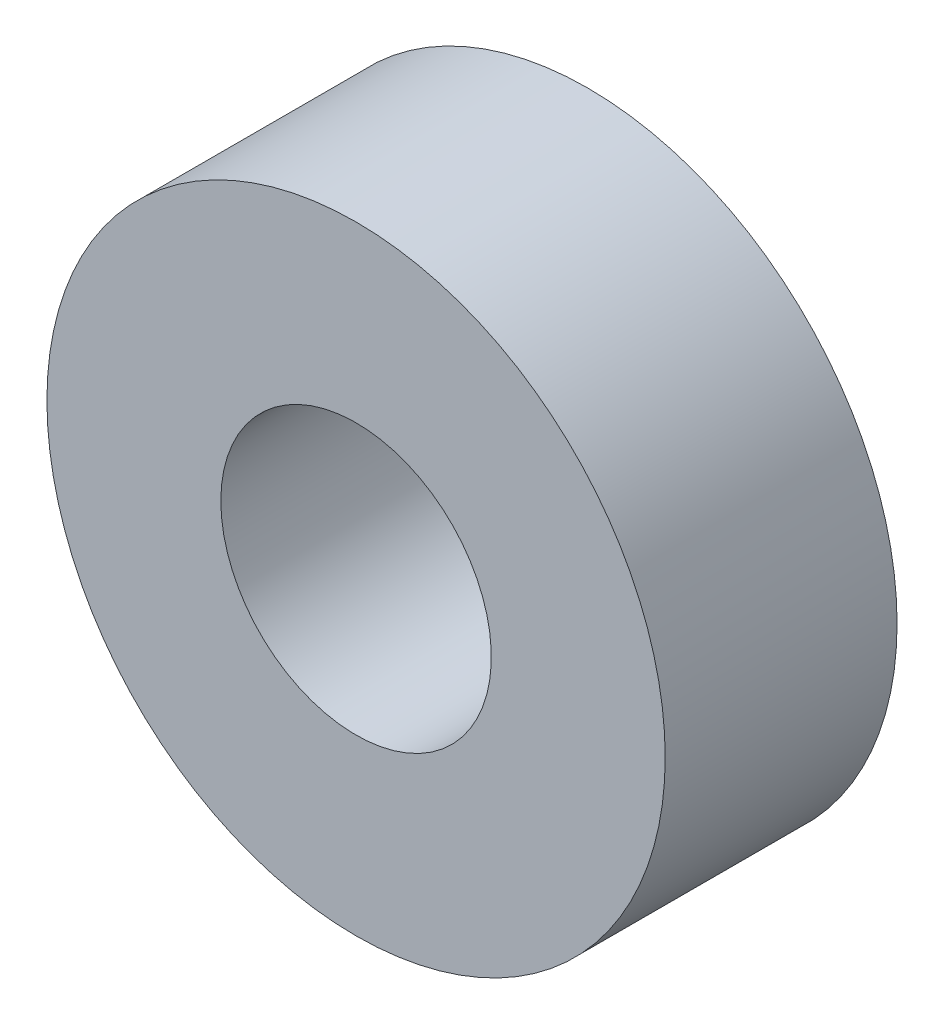
ISO-10303-21;
HEADER;
FILE_DESCRIPTION(('STEP AP214'),'2;1');
FILE_NAME('part.step','',(''),(''),'','','');
FILE_SCHEMA(('AUTOMOTIVE_DESIGN { 1 0 10303 214 1 1 1 1 }'));
ENDSEC;
DATA;
#1=APPLICATION_CONTEXT('core data for automotive mechanical design processes');
#2=APPLICATION_PROTOCOL_DEFINITION('international standard','automotive_design',2000,#1);
#3=PRODUCT_CONTEXT('',#1,'mechanical');
#4=PRODUCT('Part','Part','',(#3));
#5=PRODUCT_RELATED_PRODUCT_CATEGORY('part','',(#4));
#6=PRODUCT_DEFINITION_FORMATION('','',#4);
#7=PRODUCT_DEFINITION_CONTEXT('part definition',#1,'design');
#8=PRODUCT_DEFINITION('design','',#6,#7);
#9=PRODUCT_DEFINITION_SHAPE('','',#8);
#10=(LENGTH_UNIT() NAMED_UNIT(*) SI_UNIT(.MILLI.,.METRE.));
#11=(NAMED_UNIT(*) PLANE_ANGLE_UNIT() SI_UNIT($,.RADIAN.));
#12=(NAMED_UNIT(*) SI_UNIT($,.STERADIAN.) SOLID_ANGLE_UNIT());
#13=UNCERTAINTY_MEASURE_WITH_UNIT(LENGTH_MEASURE(1.E-05),#10,'distance_accuracy_value','');
#14=(GEOMETRIC_REPRESENTATION_CONTEXT(3) GLOBAL_UNCERTAINTY_ASSIGNED_CONTEXT((#13)) GLOBAL_UNIT_ASSIGNED_CONTEXT((#10,
#11,#12)) REPRESENTATION_CONTEXT('',''));
#15=CARTESIAN_POINT('',(0.,0.,0.));
#16=DIRECTION('',(0.,0.,1.));
#17=DIRECTION('',(1.,0.,0.));
#18=AXIS2_PLACEMENT_3D('',#15,#16,#17);
#19=CARTESIAN_POINT('',(0.,0.,0.));
#20=DIRECTION('',(0.,0.,1.));
#21=DIRECTION('',(1.,0.,0.));
#22=AXIS2_PLACEMENT_3D('',#19,#20,#21);
#23=PLANE('',#22);
#24=CARTESIAN_POINT('',(0.,0.,0.));
#25=DIRECTION('',(0.,0.,-1.));
#26=DIRECTION('',(-1.,0.,0.));
#27=AXIS2_PLACEMENT_3D('',#24,#25,#26);
#28=CIRCLE('',#27,1.75);
#29=CARTESIAN_POINT('',(-1.75,0.,0.));
#30=VERTEX_POINT('',#29);
#31=EDGE_CURVE('E27',#30,#30,#28,.F.);
#32=ORIENTED_EDGE('',*,*,#31,.T.);
#33=EDGE_LOOP('',(#32));
#34=FACE_BOUND('',#33,.T.);
#35=CARTESIAN_POINT('',(0.,0.,0.));
#36=DIRECTION('',(0.,0.,-1.));
#37=DIRECTION('',(-1.,0.,0.));
#38=AXIS2_PLACEMENT_3D('',#35,#36,#37);
#39=CIRCLE('',#38,4.);
#40=CARTESIAN_POINT('',(-4.,0.,0.));
#41=VERTEX_POINT('',#40);
#42=EDGE_CURVE('E18',#41,#41,#39,.F.);
#43=ORIENTED_EDGE('',*,*,#42,.F.);
#44=EDGE_LOOP('',(#43));
#45=FACE_BOUND('',#44,.T.);
#46=ADVANCED_FACE('F15',(#34,#45),#23,.F.);
#47=CARTESIAN_POINT('',(0.,0.,3.));
#48=DIRECTION('',(0.,0.,-1.));
#49=DIRECTION('',(-1.,0.,0.));
#50=AXIS2_PLACEMENT_3D('',#47,#48,#49);
#51=CYLINDRICAL_SURFACE('',#50,4.);
#52=ORIENTED_EDGE('',*,*,#42,.T.);
#53=EDGE_LOOP('',(#52));
#54=FACE_BOUND('',#53,.T.);
#55=CARTESIAN_POINT('',(0.,0.,3.));
#56=DIRECTION('',(0.,0.,-1.));
#57=DIRECTION('',(-1.,0.,0.));
#58=AXIS2_PLACEMENT_3D('',#55,#56,#57);
#59=CIRCLE('',#58,4.);
#60=CARTESIAN_POINT('',(-4.,0.,3.));
#61=VERTEX_POINT('',#60);
#62=EDGE_CURVE('E22',#61,#61,#59,.F.);
#63=ORIENTED_EDGE('',*,*,#62,.F.);
#64=EDGE_LOOP('',(#63));
#65=FACE_BOUND('',#64,.T.);
#66=ADVANCED_FACE('F35',(#54,#65),#51,.T.);
#67=CARTESIAN_POINT('',(0.,0.,3.));
#68=DIRECTION('',(0.,0.,-1.));
#69=DIRECTION('',(-1.,0.,0.));
#70=AXIS2_PLACEMENT_3D('',#67,#68,#69);
#71=CYLINDRICAL_SURFACE('',#70,1.75);
#72=CARTESIAN_POINT('',(0.,0.,3.));
#73=DIRECTION('',(0.,0.,-1.));
#74=DIRECTION('',(-1.,0.,0.));
#75=AXIS2_PLACEMENT_3D('',#72,#73,#74);
#76=CIRCLE('',#75,1.75);
#77=CARTESIAN_POINT('',(-1.75,0.,3.));
#78=VERTEX_POINT('',#77);
#79=EDGE_CURVE('E10',#78,#78,#76,.T.);
#80=ORIENTED_EDGE('',*,*,#79,.F.);
#81=EDGE_LOOP('',(#80));
#82=FACE_BOUND('',#81,.T.);
#83=ORIENTED_EDGE('',*,*,#31,.F.);
#84=EDGE_LOOP('',(#83));
#85=FACE_BOUND('',#84,.T.);
#86=ADVANCED_FACE('F43',(#82,#85),#71,.F.);
#87=CARTESIAN_POINT('',(0.,0.,3.));
#88=DIRECTION('',(0.,0.,1.));
#89=DIRECTION('',(1.,0.,0.));
#90=AXIS2_PLACEMENT_3D('',#87,#88,#89);
#91=PLANE('',#90);
#92=ORIENTED_EDGE('',*,*,#79,.T.);
#93=EDGE_LOOP('',(#92));
#94=FACE_BOUND('',#93,.T.);
#95=ORIENTED_EDGE('',*,*,#62,.T.);
#96=EDGE_LOOP('',(#95));
#97=FACE_BOUND('',#96,.T.);
#98=ADVANCED_FACE('F44',(#94,#97),#91,.T.);
#99=CLOSED_SHELL('',(#46,#66,#86,#98));
#100=MANIFOLD_SOLID_BREP('B1',#99);
#101=ADVANCED_BREP_SHAPE_REPRESENTATION('',(#18,#100),#14);
#102=SHAPE_DEFINITION_REPRESENTATION(#9,#101);
ENDSEC;
END-ISO-10303-21;
